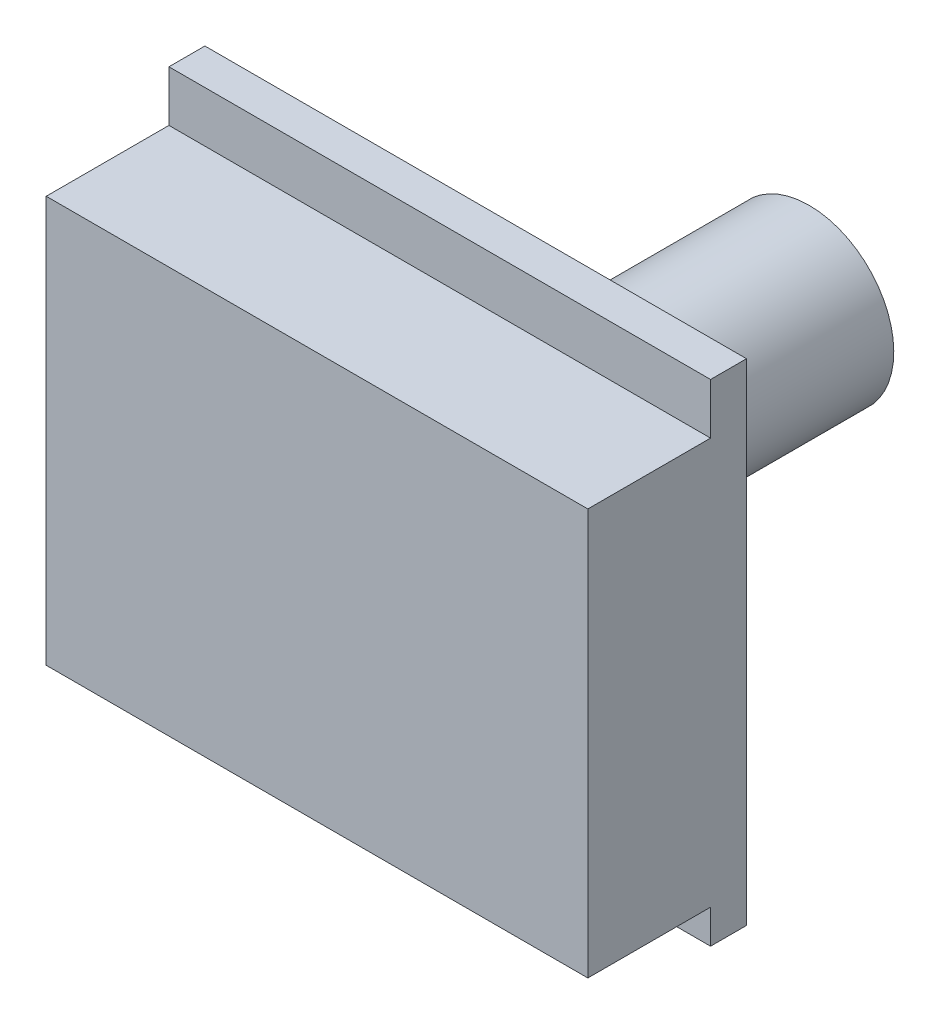
ISO-10303-21;
HEADER;
FILE_DESCRIPTION(('STEP AP214'),'2;1');
FILE_NAME('part.step','',(''),(''),'','','');
FILE_SCHEMA(('AUTOMOTIVE_DESIGN { 1 0 10303 214 1 1 1 1 }'));
ENDSEC;
DATA;
#1=APPLICATION_CONTEXT('core data for automotive mechanical design processes');
#2=APPLICATION_PROTOCOL_DEFINITION('international standard','automotive_design',2000,#1);
#3=PRODUCT_CONTEXT('',#1,'mechanical');
#4=PRODUCT('Part','Part','',(#3));
#5=PRODUCT_RELATED_PRODUCT_CATEGORY('part','',(#4));
#6=PRODUCT_DEFINITION_FORMATION('','',#4);
#7=PRODUCT_DEFINITION_CONTEXT('part definition',#1,'design');
#8=PRODUCT_DEFINITION('design','',#6,#7);
#9=PRODUCT_DEFINITION_SHAPE('','',#8);
#10=(LENGTH_UNIT() NAMED_UNIT(*) SI_UNIT(.MILLI.,.METRE.));
#11=(NAMED_UNIT(*) PLANE_ANGLE_UNIT() SI_UNIT($,.RADIAN.));
#12=(NAMED_UNIT(*) SI_UNIT($,.STERADIAN.) SOLID_ANGLE_UNIT());
#13=UNCERTAINTY_MEASURE_WITH_UNIT(LENGTH_MEASURE(1.E-05),#10,'distance_accuracy_value','');
#14=(GEOMETRIC_REPRESENTATION_CONTEXT(3) GLOBAL_UNCERTAINTY_ASSIGNED_CONTEXT((#13)) GLOBAL_UNIT_ASSIGNED_CONTEXT((#10,
#11,#12)) REPRESENTATION_CONTEXT('',''));
#15=CARTESIAN_POINT('',(0.,0.,0.));
#16=DIRECTION('',(0.,0.,1.));
#17=DIRECTION('',(1.,0.,0.));
#18=AXIS2_PLACEMENT_3D('',#15,#16,#17);
#19=CARTESIAN_POINT('',(5.65,-4.05,3.));
#20=DIRECTION('',(-1.,0.,0.));
#21=DIRECTION('',(0.,0.,1.));
#22=AXIS2_PLACEMENT_3D('',#19,#20,#21);
#23=PLANE('',#22);
#24=DIRECTION('',(0.,1.,0.));
#25=VECTOR('',#24,1.);
#26=CARTESIAN_POINT('',(5.65,-4.05,3.));
#27=LINE('',#26,#25);
#28=CARTESIAN_POINT('',(5.65,-4.05,3.));
#29=VERTEX_POINT('',#28);
#30=CARTESIAN_POINT('',(5.65,-0.500000000000001,3.));
#31=VERTEX_POINT('',#30);
#32=EDGE_CURVE('E393',#29,#31,#27,.T.);
#33=ORIENTED_EDGE('',*,*,#32,.T.);
#34=DIRECTION('',(0.,0.,1.));
#35=VECTOR('',#34,1.);
#36=CARTESIAN_POINT('',(5.65,-0.500000000000002,0.));
#37=LINE('',#36,#35);
#38=CARTESIAN_POINT('',(5.65,-0.500000000000001,0.));
#39=VERTEX_POINT('',#38);
#40=EDGE_CURVE('E61',#39,#31,#37,.T.);
#41=ORIENTED_EDGE('',*,*,#40,.F.);
#42=DIRECTION('',(0.,1.,0.));
#43=VECTOR('',#42,1.);
#44=CARTESIAN_POINT('',(5.65,-4.05,0.));
#45=LINE('',#44,#43);
#46=CARTESIAN_POINT('',(5.65,-4.05,0.));
#47=VERTEX_POINT('',#46);
#48=EDGE_CURVE('E409',#47,#39,#45,.T.);
#49=ORIENTED_EDGE('',*,*,#48,.F.);
#50=DIRECTION('',(0.,0.,-1.));
#51=VECTOR('',#50,1.);
#52=CARTESIAN_POINT('',(5.65,-4.05,3.));
#53=LINE('',#52,#51);
#54=EDGE_CURVE('E408',#29,#47,#53,.T.);
#55=ORIENTED_EDGE('',*,*,#54,.F.);
#56=EDGE_LOOP('',(#33,#41,#49,#55));
#57=FACE_BOUND('',#56,.T.);
#58=ADVANCED_FACE('F35',(#57),#23,.T.);
#59=CARTESIAN_POINT('',(-5.65,4.05,3.));
#60=DIRECTION('',(0.,-1.,0.));
#61=DIRECTION('',(0.,0.,-1.));
#62=AXIS2_PLACEMENT_3D('',#59,#60,#61);
#63=PLANE('',#62);
#64=DIRECTION('',(0.,0.,1.));
#65=VECTOR('',#64,1.);
#66=CARTESIAN_POINT('',(-0.5,4.05,0.));
#67=LINE('',#66,#65);
#68=CARTESIAN_POINT('',(-0.5,4.05,0.));
#69=VERTEX_POINT('',#68);
#70=CARTESIAN_POINT('',(-0.5,4.05,3.));
#71=VERTEX_POINT('',#70);
#72=EDGE_CURVE('E329',#69,#71,#67,.T.);
#73=ORIENTED_EDGE('',*,*,#72,.T.);
#74=DIRECTION('',(-1.,0.,0.));
#75=VECTOR('',#74,1.);
#76=CARTESIAN_POINT('',(-5.65,4.05,3.));
#77=LINE('',#76,#75);
#78=CARTESIAN_POINT('',(-5.65,4.05,3.));
#79=VERTEX_POINT('',#78);
#80=EDGE_CURVE('E395',#71,#79,#77,.T.);
#81=ORIENTED_EDGE('',*,*,#80,.T.);
#82=DIRECTION('',(0.,0.,-1.));
#83=VECTOR('',#82,1.);
#84=CARTESIAN_POINT('',(-5.65,4.05,3.));
#85=LINE('',#84,#83);
#86=CARTESIAN_POINT('',(-5.65,4.05,0.));
#87=VERTEX_POINT('',#86);
#88=EDGE_CURVE('E426',#79,#87,#85,.T.);
#89=ORIENTED_EDGE('',*,*,#88,.T.);
#90=DIRECTION('',(-1.,0.,0.));
#91=VECTOR('',#90,1.);
#92=CARTESIAN_POINT('',(-5.65,4.05,0.));
#93=LINE('',#92,#91);
#94=EDGE_CURVE('E411',#69,#87,#93,.T.);
#95=ORIENTED_EDGE('',*,*,#94,.F.);
#96=EDGE_LOOP('',(#73,#81,#89,#95));
#97=FACE_BOUND('',#96,.T.);
#98=ADVANCED_FACE('F481',(#97),#63,.T.);
#99=CARTESIAN_POINT('',(-5.65,-4.05,3.));
#100=DIRECTION('',(1.,0.,0.));
#101=DIRECTION('',(0.,0.,-1.));
#102=AXIS2_PLACEMENT_3D('',#99,#100,#101);
#103=PLANE('',#102);
#104=DIRECTION('',(0.,-1.,0.));
#105=VECTOR('',#104,1.);
#106=CARTESIAN_POINT('',(-5.65,-4.05,3.));
#107=LINE('',#106,#105);
#108=CARTESIAN_POINT('',(-5.65,0.5,3.));
#109=VERTEX_POINT('',#108);
#110=EDGE_CURVE('E401',#79,#109,#107,.T.);
#111=ORIENTED_EDGE('',*,*,#110,.T.);
#112=DIRECTION('',(0.,0.,1.));
#113=VECTOR('',#112,1.);
#114=CARTESIAN_POINT('',(-5.65,0.5,0.));
#115=LINE('',#114,#113);
#116=CARTESIAN_POINT('',(-5.65,0.5,0.));
#117=VERTEX_POINT('',#116);
#118=EDGE_CURVE('E235',#117,#109,#115,.T.);
#119=ORIENTED_EDGE('',*,*,#118,.F.);
#120=DIRECTION('',(0.,-1.,0.));
#121=VECTOR('',#120,1.);
#122=CARTESIAN_POINT('',(-5.65,-4.05,0.));
#123=LINE('',#122,#121);
#124=EDGE_CURVE('E245',#87,#117,#123,.T.);
#125=ORIENTED_EDGE('',*,*,#124,.F.);
#126=ORIENTED_EDGE('',*,*,#88,.F.);
#127=EDGE_LOOP('',(#111,#119,#125,#126));
#128=FACE_BOUND('',#127,.T.);
#129=ADVANCED_FACE('F485',(#128),#103,.T.);
#130=CARTESIAN_POINT('',(-5.65,-4.05,3.));
#131=DIRECTION('',(0.,1.,0.));
#132=DIRECTION('',(0.,0.,1.));
#133=AXIS2_PLACEMENT_3D('',#130,#131,#132);
#134=PLANE('',#133);
#135=DIRECTION('',(1.,0.,0.));
#136=VECTOR('',#135,1.);
#137=CARTESIAN_POINT('',(-5.65,-4.05,0.));
#138=LINE('',#137,#136);
#139=CARTESIAN_POINT('',(0.5,-4.05,0.));
#140=VERTEX_POINT('',#139);
#141=EDGE_CURVE('E417',#140,#47,#138,.T.);
#142=ORIENTED_EDGE('',*,*,#141,.F.);
#143=DIRECTION('',(0.,0.,1.));
#144=VECTOR('',#143,1.);
#145=CARTESIAN_POINT('',(0.499999999999999,-4.05,0.));
#146=LINE('',#145,#144);
#147=CARTESIAN_POINT('',(0.499999999999999,-4.05,3.));
#148=VERTEX_POINT('',#147);
#149=EDGE_CURVE('E308',#140,#148,#146,.T.);
#150=ORIENTED_EDGE('',*,*,#149,.T.);
#151=DIRECTION('',(1.,0.,0.));
#152=VECTOR('',#151,1.);
#153=CARTESIAN_POINT('',(-5.65,-4.05,3.));
#154=LINE('',#153,#152);
#155=EDGE_CURVE('E404',#148,#29,#154,.T.);
#156=ORIENTED_EDGE('',*,*,#155,.T.);
#157=ORIENTED_EDGE('',*,*,#54,.T.);
#158=EDGE_LOOP('',(#142,#150,#156,#157));
#159=FACE_BOUND('',#158,.T.);
#160=ADVANCED_FACE('F515',(#159),#134,.T.);
#161=CARTESIAN_POINT('',(0.,0.,3.));
#162=DIRECTION('',(0.,0.,1.));
#163=DIRECTION('',(1.,0.,0.));
#164=AXIS2_PLACEMENT_3D('',#161,#162,#163);
#165=PLANE('',#164);
#166=DIRECTION('',(1.,0.,0.));
#167=VECTOR('',#166,1.);
#168=CARTESIAN_POINT('',(0.,0.5,3.));
#169=LINE('',#168,#167);
#170=CARTESIAN_POINT('',(-1.93649167310371,0.5,3.));
#171=VERTEX_POINT('',#170);
#172=EDGE_CURVE('E231',#109,#171,#169,.T.);
#173=ORIENTED_EDGE('',*,*,#172,.F.);
#174=ORIENTED_EDGE('',*,*,#110,.F.);
#175=ORIENTED_EDGE('',*,*,#80,.F.);
#176=DIRECTION('',(0.,-1.,0.));
#177=VECTOR('',#176,1.);
#178=CARTESIAN_POINT('',(-0.500000000000001,0.,3.));
#179=LINE('',#178,#177);
#180=CARTESIAN_POINT('',(-0.5,1.93649167310371,3.));
#181=VERTEX_POINT('',#180);
#182=EDGE_CURVE('E290',#71,#181,#179,.T.);
#183=ORIENTED_EDGE('',*,*,#182,.T.);
#184=CARTESIAN_POINT('',(0.,0.,3.));
#185=DIRECTION('',(0.,0.,-1.));
#186=DIRECTION('',(-1.,0.,0.));
#187=AXIS2_PLACEMENT_3D('',#184,#185,#186);
#188=CIRCLE('',#187,2.);
#189=EDGE_CURVE('E288',#181,#171,#188,.F.);
#190=ORIENTED_EDGE('',*,*,#189,.T.);
#191=EDGE_LOOP('',(#173,#174,#175,#183,#190));
#192=FACE_BOUND('',#191,.T.);
#193=ADVANCED_FACE('F502',(#192),#165,.F.);
#194=CARTESIAN_POINT('',(0.,0.,3.));
#195=DIRECTION('',(0.,0.,-1.));
#196=DIRECTION('',(-1.,0.,0.));
#197=AXIS2_PLACEMENT_3D('',#194,#195,#196);
#198=CIRCLE('',#197,2.);
#199=CARTESIAN_POINT('',(-0.5,-1.93649167310371,3.));
#200=VERTEX_POINT('',#199);
#201=CARTESIAN_POINT('',(-1.93649167310371,-0.5,3.));
#202=VERTEX_POINT('',#201);
#203=EDGE_CURVE('E283',#200,#202,#198,.T.);
#204=ORIENTED_EDGE('',*,*,#203,.F.);
#205=DIRECTION('',(0.,-1.,0.));
#206=VECTOR('',#205,1.);
#207=CARTESIAN_POINT('',(-0.5,0.,3.));
#208=LINE('',#207,#206);
#209=CARTESIAN_POINT('',(-0.5,-4.05,3.));
#210=VERTEX_POINT('',#209);
#211=EDGE_CURVE('E281',#200,#210,#208,.T.);
#212=ORIENTED_EDGE('',*,*,#211,.T.);
#213=CARTESIAN_POINT('',(-5.65,-4.05,3.));
#214=VERTEX_POINT('',#213);
#215=EDGE_CURVE('E405',#214,#210,#154,.T.);
#216=ORIENTED_EDGE('',*,*,#215,.F.);
#217=CARTESIAN_POINT('',(-5.65,-0.5,3.));
#218=VERTEX_POINT('',#217);
#219=EDGE_CURVE('E400',#218,#214,#107,.T.);
#220=ORIENTED_EDGE('',*,*,#219,.F.);
#221=DIRECTION('',(1.,0.,0.));
#222=VECTOR('',#221,1.);
#223=CARTESIAN_POINT('',(0.,-0.5,3.));
#224=LINE('',#223,#222);
#225=EDGE_CURVE('E285',#218,#202,#224,.T.);
#226=ORIENTED_EDGE('',*,*,#225,.T.);
#227=EDGE_LOOP('',(#204,#212,#216,#220,#226));
#228=FACE_BOUND('',#227,.T.);
#229=ADVANCED_FACE('F495',(#228),#165,.F.);
#230=DIRECTION('',(-1.,0.,0.));
#231=VECTOR('',#230,1.);
#232=CARTESIAN_POINT('',(0.,-0.5,3.));
#233=LINE('',#232,#231);
#234=CARTESIAN_POINT('',(1.93649167310371,-0.500000000000001,3.));
#235=VERTEX_POINT('',#234);
#236=EDGE_CURVE('E298',#31,#235,#233,.T.);
#237=ORIENTED_EDGE('',*,*,#236,.F.);
#238=ORIENTED_EDGE('',*,*,#32,.F.);
#239=ORIENTED_EDGE('',*,*,#155,.F.);
#240=DIRECTION('',(0.,-1.,0.));
#241=VECTOR('',#240,1.);
#242=CARTESIAN_POINT('',(0.500000000000001,0.,3.));
#243=LINE('',#242,#241);
#244=CARTESIAN_POINT('',(0.5,-1.93649167310371,3.));
#245=VERTEX_POINT('',#244);
#246=EDGE_CURVE('E265',#245,#148,#243,.T.);
#247=ORIENTED_EDGE('',*,*,#246,.F.);
#248=CARTESIAN_POINT('',(0.,0.,3.));
#249=DIRECTION('',(0.,0.,-1.));
#250=DIRECTION('',(-1.,0.,0.));
#251=AXIS2_PLACEMENT_3D('',#248,#249,#250);
#252=CIRCLE('',#251,2.);
#253=EDGE_CURVE('E301',#235,#245,#252,.T.);
#254=ORIENTED_EDGE('',*,*,#253,.F.);
#255=EDGE_LOOP('',(#237,#238,#239,#247,#254));
#256=FACE_BOUND('',#255,.T.);
#257=ADVANCED_FACE('F490',(#256),#165,.F.);
#258=CARTESIAN_POINT('',(0.,0.,0.));
#259=DIRECTION('',(0.,0.,-1.));
#260=DIRECTION('',(-1.,0.,0.));
#261=AXIS2_PLACEMENT_3D('',#258,#259,#260);
#262=PLANE('',#261);
#263=CARTESIAN_POINT('',(0.,0.,0.));
#264=DIRECTION('',(0.,0.,-1.));
#265=DIRECTION('',(-1.,0.,0.));
#266=AXIS2_PLACEMENT_3D('',#263,#264,#265);
#267=CIRCLE('',#266,2.);
#268=CARTESIAN_POINT('',(-0.5,1.93649167310371,0.));
#269=VERTEX_POINT('',#268);
#270=CARTESIAN_POINT('',(0.5,1.93649167310371,0.));
#271=VERTEX_POINT('',#270);
#272=EDGE_CURVE('E11',#269,#271,#267,.T.);
#273=ORIENTED_EDGE('',*,*,#272,.F.);
#274=DIRECTION('',(0.,-1.,0.));
#275=VECTOR('',#274,1.);
#276=CARTESIAN_POINT('',(-0.500000000000001,0.,0.));
#277=LINE('',#276,#275);
#278=EDGE_CURVE('E246',#69,#269,#277,.T.);
#279=ORIENTED_EDGE('',*,*,#278,.F.);
#280=ORIENTED_EDGE('',*,*,#94,.T.);
#281=ORIENTED_EDGE('',*,*,#124,.T.);
#282=DIRECTION('',(1.,0.,0.));
#283=VECTOR('',#282,1.);
#284=CARTESIAN_POINT('',(0.,0.5,0.));
#285=LINE('',#284,#283);
#286=CARTESIAN_POINT('',(-1.93649167310371,0.5,0.));
#287=VERTEX_POINT('',#286);
#288=EDGE_CURVE('E230',#117,#287,#285,.T.);
#289=ORIENTED_EDGE('',*,*,#288,.T.);
#290=CARTESIAN_POINT('',(-1.93649167310371,-0.5,0.));
#291=VERTEX_POINT('',#290);
#292=EDGE_CURVE('E46',#291,#287,#267,.T.);
#293=ORIENTED_EDGE('',*,*,#292,.F.);
#294=DIRECTION('',(1.,0.,0.));
#295=VECTOR('',#294,1.);
#296=CARTESIAN_POINT('',(0.,-0.5,0.));
#297=LINE('',#296,#295);
#298=CARTESIAN_POINT('',(-5.65,-0.5,0.));
#299=VERTEX_POINT('',#298);
#300=EDGE_CURVE('E247',#299,#291,#297,.T.);
#301=ORIENTED_EDGE('',*,*,#300,.F.);
#302=CARTESIAN_POINT('',(-5.65,-4.05,0.));
#303=VERTEX_POINT('',#302);
#304=EDGE_CURVE('E415',#299,#303,#123,.T.);
#305=ORIENTED_EDGE('',*,*,#304,.T.);
#306=CARTESIAN_POINT('',(-0.5,-4.05,0.));
#307=VERTEX_POINT('',#306);
#308=EDGE_CURVE('E418',#303,#307,#138,.T.);
#309=ORIENTED_EDGE('',*,*,#308,.T.);
#310=DIRECTION('',(0.,-1.,0.));
#311=VECTOR('',#310,1.);
#312=CARTESIAN_POINT('',(-0.5,0.,0.));
#313=LINE('',#312,#311);
#314=CARTESIAN_POINT('',(-0.5,-1.93649167310371,0.));
#315=VERTEX_POINT('',#314);
#316=EDGE_CURVE('E262',#315,#307,#313,.T.);
#317=ORIENTED_EDGE('',*,*,#316,.F.);
#318=CARTESIAN_POINT('',(0.5,-1.93649167310371,0.));
#319=VERTEX_POINT('',#318);
#320=EDGE_CURVE('E255',#319,#315,#267,.T.);
#321=ORIENTED_EDGE('',*,*,#320,.F.);
#322=DIRECTION('',(0.,-1.,0.));
#323=VECTOR('',#322,1.);
#324=CARTESIAN_POINT('',(0.500000000000001,0.,0.));
#325=LINE('',#324,#323);
#326=EDGE_CURVE('E277',#319,#140,#325,.T.);
#327=ORIENTED_EDGE('',*,*,#326,.T.);
#328=ORIENTED_EDGE('',*,*,#141,.T.);
#329=ORIENTED_EDGE('',*,*,#48,.T.);
#330=DIRECTION('',(-1.,0.,0.));
#331=VECTOR('',#330,1.);
#332=CARTESIAN_POINT('',(0.,-0.5,0.));
#333=LINE('',#332,#331);
#334=CARTESIAN_POINT('',(1.93649167310371,-0.500000000000001,0.));
#335=VERTEX_POINT('',#334);
#336=EDGE_CURVE('E275',#39,#335,#333,.T.);
#337=ORIENTED_EDGE('',*,*,#336,.T.);
#338=CARTESIAN_POINT('',(1.93649167310371,0.499999999999998,0.));
#339=VERTEX_POINT('',#338);
#340=EDGE_CURVE('E44',#339,#335,#267,.T.);
#341=ORIENTED_EDGE('',*,*,#340,.F.);
#342=DIRECTION('',(-1.,0.,0.));
#343=VECTOR('',#342,1.);
#344=CARTESIAN_POINT('',(0.,0.499999999999999,0.));
#345=LINE('',#344,#343);
#346=CARTESIAN_POINT('',(5.65,0.499999999999998,0.));
#347=VERTEX_POINT('',#346);
#348=EDGE_CURVE('E272',#347,#339,#345,.T.);
#349=ORIENTED_EDGE('',*,*,#348,.F.);
#350=CARTESIAN_POINT('',(5.65,4.05,0.));
#351=VERTEX_POINT('',#350);
#352=EDGE_CURVE('E53',#347,#351,#45,.T.);
#353=ORIENTED_EDGE('',*,*,#352,.T.);
#354=CARTESIAN_POINT('',(0.5,4.05,0.));
#355=VERTEX_POINT('',#354);
#356=EDGE_CURVE('E412',#351,#355,#93,.T.);
#357=ORIENTED_EDGE('',*,*,#356,.T.);
#358=DIRECTION('',(0.,1.,0.));
#359=VECTOR('',#358,1.);
#360=CARTESIAN_POINT('',(0.500000000000001,0.,0.));
#361=LINE('',#360,#359);
#362=EDGE_CURVE('E269',#271,#355,#361,.T.);
#363=ORIENTED_EDGE('',*,*,#362,.F.);
#364=EDGE_LOOP('',(#273,#279,#280,#281,#289,#293,#301,#305,#309,#317,#321,#327,#328,#329,#337,
#341,#349,#353,#357,#363));
#365=FACE_BOUND('',#364,.T.);
#366=DIRECTION('',(0.,-1.,0.));
#367=VECTOR('',#366,1.);
#368=CARTESIAN_POINT('',(-6.4,4.8,0.));
#369=LINE('',#368,#367);
#370=CARTESIAN_POINT('',(-6.4,6.,0.));
#371=VERTEX_POINT('',#370);
#372=CARTESIAN_POINT('',(-6.4,-5.6,0.));
#373=VERTEX_POINT('',#372);
#374=EDGE_CURVE('E431',#371,#373,#369,.T.);
#375=ORIENTED_EDGE('',*,*,#374,.F.);
#376=DIRECTION('',(1.,0.,0.));
#377=VECTOR('',#376,1.);
#378=CARTESIAN_POINT('',(-6.4,6.,0.));
#379=LINE('',#378,#377);
#380=CARTESIAN_POINT('',(6.4,6.,0.));
#381=VERTEX_POINT('',#380);
#382=EDGE_CURVE('E359',#371,#381,#379,.T.);
#383=ORIENTED_EDGE('',*,*,#382,.T.);
#384=DIRECTION('',(0.,1.,0.));
#385=VECTOR('',#384,1.);
#386=CARTESIAN_POINT('',(6.4,4.8,0.));
#387=LINE('',#386,#385);
#388=CARTESIAN_POINT('',(6.4,-5.6,0.));
#389=VERTEX_POINT('',#388);
#390=EDGE_CURVE('E433',#389,#381,#387,.T.);
#391=ORIENTED_EDGE('',*,*,#390,.F.);
#392=DIRECTION('',(-1.,0.,0.));
#393=VECTOR('',#392,1.);
#394=CARTESIAN_POINT('',(-6.4,-5.6,0.));
#395=LINE('',#394,#393);
#396=EDGE_CURVE('E340',#389,#373,#395,.T.);
#397=ORIENTED_EDGE('',*,*,#396,.T.);
#398=EDGE_LOOP('',(#375,#383,#391,#397));
#399=FACE_BOUND('',#398,.T.);
#400=ADVANCED_FACE('F240',(#365,#399),#262,.T.);
#401=CARTESIAN_POINT('',(-6.4,4.8,3.));
#402=DIRECTION('',(1.,0.,0.));
#403=DIRECTION('',(0.,0.,-1.));
#404=AXIS2_PLACEMENT_3D('',#401,#402,#403);
#405=PLANE('',#404);
#406=ORIENTED_EDGE('',*,*,#374,.T.);
#407=DIRECTION('',(0.,0.,-1.));
#408=VECTOR('',#407,1.);
#409=CARTESIAN_POINT('',(-6.4,-5.6,0.85));
#410=LINE('',#409,#408);
#411=CARTESIAN_POINT('',(-6.4,-5.6,0.85));
#412=VERTEX_POINT('',#411);
#413=EDGE_CURVE('E356',#412,#373,#410,.T.);
#414=ORIENTED_EDGE('',*,*,#413,.F.);
#415=DIRECTION('',(0.,1.,0.));
#416=VECTOR('',#415,1.);
#417=CARTESIAN_POINT('',(-6.4,-4.8,0.85));
#418=LINE('',#417,#416);
#419=CARTESIAN_POINT('',(-6.4,-4.8,0.85));
#420=VERTEX_POINT('',#419);
#421=EDGE_CURVE('E341',#412,#420,#418,.T.);
#422=ORIENTED_EDGE('',*,*,#421,.T.);
#423=DIRECTION('',(0.,0.,-1.));
#424=VECTOR('',#423,1.);
#425=CARTESIAN_POINT('',(-6.4,-4.8,3.));
#426=LINE('',#425,#424);
#427=CARTESIAN_POINT('',(-6.4,-4.8,3.75));
#428=VERTEX_POINT('',#427);
#429=EDGE_CURVE('E39',#428,#420,#426,.T.);
#430=ORIENTED_EDGE('',*,*,#429,.F.);
#431=DIRECTION('',(0.,-1.,0.));
#432=VECTOR('',#431,1.);
#433=CARTESIAN_POINT('',(-6.4,4.8,3.75));
#434=LINE('',#433,#432);
#435=CARTESIAN_POINT('',(-6.4,4.8,3.75));
#436=VERTEX_POINT('',#435);
#437=EDGE_CURVE('E379',#436,#428,#434,.T.);
#438=ORIENTED_EDGE('',*,*,#437,.F.);
#439=DIRECTION('',(0.,0.,-1.));
#440=VECTOR('',#439,1.);
#441=CARTESIAN_POINT('',(-6.4,4.8,3.));
#442=LINE('',#441,#440);
#443=CARTESIAN_POINT('',(-6.4,4.8,0.85));
#444=VERTEX_POINT('',#443);
#445=EDGE_CURVE('E435',#436,#444,#442,.T.);
#446=ORIENTED_EDGE('',*,*,#445,.T.);
#447=DIRECTION('',(0.,1.,0.));
#448=VECTOR('',#447,1.);
#449=CARTESIAN_POINT('',(-6.4,4.8,0.85));
#450=LINE('',#449,#448);
#451=CARTESIAN_POINT('',(-6.4,6.,0.85));
#452=VERTEX_POINT('',#451);
#453=EDGE_CURVE('E362',#444,#452,#450,.T.);
#454=ORIENTED_EDGE('',*,*,#453,.T.);
#455=DIRECTION('',(0.,0.,-1.));
#456=VECTOR('',#455,1.);
#457=CARTESIAN_POINT('',(-6.4,6.,0.85));
#458=LINE('',#457,#456);
#459=EDGE_CURVE('E373',#452,#371,#458,.T.);
#460=ORIENTED_EDGE('',*,*,#459,.T.);
#461=EDGE_LOOP('',(#406,#414,#422,#430,#438,#446,#454,#460));
#462=FACE_BOUND('',#461,.T.);
#463=ADVANCED_FACE('F37',(#462),#405,.F.);
#464=CARTESIAN_POINT('',(6.4,-4.8,3.));
#465=DIRECTION('',(0.,1.,0.));
#466=DIRECTION('',(0.,0.,1.));
#467=AXIS2_PLACEMENT_3D('',#464,#465,#466);
#468=PLANE('',#467);
#469=ORIENTED_EDGE('',*,*,#429,.T.);
#470=DIRECTION('',(1.,0.,0.));
#471=VECTOR('',#470,1.);
#472=CARTESIAN_POINT('',(-6.4,-4.8,0.85));
#473=LINE('',#472,#471);
#474=CARTESIAN_POINT('',(6.4,-4.8,0.85));
#475=VERTEX_POINT('',#474);
#476=EDGE_CURVE('E344',#420,#475,#473,.T.);
#477=ORIENTED_EDGE('',*,*,#476,.T.);
#478=DIRECTION('',(0.,0.,-1.));
#479=VECTOR('',#478,1.);
#480=CARTESIAN_POINT('',(6.4,-4.8,3.));
#481=LINE('',#480,#479);
#482=CARTESIAN_POINT('',(6.4,-4.8,3.75));
#483=VERTEX_POINT('',#482);
#484=EDGE_CURVE('E258',#483,#475,#481,.T.);
#485=ORIENTED_EDGE('',*,*,#484,.F.);
#486=DIRECTION('',(1.,0.,0.));
#487=VECTOR('',#486,1.);
#488=CARTESIAN_POINT('',(-6.4,-4.8,3.75));
#489=LINE('',#488,#487);
#490=EDGE_CURVE('E384',#428,#483,#489,.T.);
#491=ORIENTED_EDGE('',*,*,#490,.F.);
#492=EDGE_LOOP('',(#469,#477,#485,#491));
#493=FACE_BOUND('',#492,.T.);
#494=ADVANCED_FACE('F447',(#493),#468,.F.);
#495=CARTESIAN_POINT('',(6.4,4.8,3.));
#496=DIRECTION('',(-1.,0.,0.));
#497=DIRECTION('',(0.,0.,1.));
#498=AXIS2_PLACEMENT_3D('',#495,#496,#497);
#499=PLANE('',#498);
#500=ORIENTED_EDGE('',*,*,#390,.T.);
#501=DIRECTION('',(0.,0.,-1.));
#502=VECTOR('',#501,1.);
#503=CARTESIAN_POINT('',(6.4,6.,0.85));
#504=LINE('',#503,#502);
#505=CARTESIAN_POINT('',(6.4,6.,0.85));
#506=VERTEX_POINT('',#505);
#507=EDGE_CURVE('E376',#506,#381,#504,.T.);
#508=ORIENTED_EDGE('',*,*,#507,.F.);
#509=DIRECTION('',(0.,-1.,0.));
#510=VECTOR('',#509,1.);
#511=CARTESIAN_POINT('',(6.4,4.8,0.85));
#512=LINE('',#511,#510);
#513=CARTESIAN_POINT('',(6.4,4.8,0.85));
#514=VERTEX_POINT('',#513);
#515=EDGE_CURVE('E368',#506,#514,#512,.T.);
#516=ORIENTED_EDGE('',*,*,#515,.T.);
#517=DIRECTION('',(0.,0.,-1.));
#518=VECTOR('',#517,1.);
#519=CARTESIAN_POINT('',(6.4,4.8,3.));
#520=LINE('',#519,#518);
#521=CARTESIAN_POINT('',(6.4,4.8,3.75));
#522=VERTEX_POINT('',#521);
#523=EDGE_CURVE('E438',#522,#514,#520,.T.);
#524=ORIENTED_EDGE('',*,*,#523,.F.);
#525=DIRECTION('',(0.,1.,0.));
#526=VECTOR('',#525,1.);
#527=CARTESIAN_POINT('',(6.4,4.8,3.75));
#528=LINE('',#527,#526);
#529=EDGE_CURVE('E387',#483,#522,#528,.T.);
#530=ORIENTED_EDGE('',*,*,#529,.F.);
#531=ORIENTED_EDGE('',*,*,#484,.T.);
#532=DIRECTION('',(0.,-1.,0.));
#533=VECTOR('',#532,1.);
#534=CARTESIAN_POINT('',(6.4,-4.8,0.85));
#535=LINE('',#534,#533);
#536=CARTESIAN_POINT('',(6.4,-5.6,0.85));
#537=VERTEX_POINT('',#536);
#538=EDGE_CURVE('E347',#475,#537,#535,.T.);
#539=ORIENTED_EDGE('',*,*,#538,.T.);
#540=DIRECTION('',(0.,0.,-1.));
#541=VECTOR('',#540,1.);
#542=CARTESIAN_POINT('',(6.4,-5.6,0.85));
#543=LINE('',#542,#541);
#544=EDGE_CURVE('E353',#537,#389,#543,.T.);
#545=ORIENTED_EDGE('',*,*,#544,.T.);
#546=EDGE_LOOP('',(#500,#508,#516,#524,#530,#531,#539,#545));
#547=FACE_BOUND('',#546,.T.);
#548=ADVANCED_FACE('F443',(#547),#499,.F.);
#549=CARTESIAN_POINT('',(6.4,4.8,3.));
#550=DIRECTION('',(0.,-1.,0.));
#551=DIRECTION('',(0.,0.,-1.));
#552=AXIS2_PLACEMENT_3D('',#549,#550,#551);
#553=PLANE('',#552);
#554=ORIENTED_EDGE('',*,*,#523,.T.);
#555=DIRECTION('',(-1.,0.,0.));
#556=VECTOR('',#555,1.);
#557=CARTESIAN_POINT('',(-6.4,4.8,0.85));
#558=LINE('',#557,#556);
#559=EDGE_CURVE('E370',#514,#444,#558,.T.);
#560=ORIENTED_EDGE('',*,*,#559,.T.);
#561=ORIENTED_EDGE('',*,*,#445,.F.);
#562=DIRECTION('',(-1.,0.,0.));
#563=VECTOR('',#562,1.);
#564=CARTESIAN_POINT('',(-6.4,4.8,3.75));
#565=LINE('',#564,#563);
#566=EDGE_CURVE('E390',#522,#436,#565,.T.);
#567=ORIENTED_EDGE('',*,*,#566,.F.);
#568=EDGE_LOOP('',(#554,#560,#561,#567));
#569=FACE_BOUND('',#568,.T.);
#570=ADVANCED_FACE('F468',(#569),#553,.F.);
#571=DIRECTION('',(0.,0.,1.));
#572=VECTOR('',#571,1.);
#573=CARTESIAN_POINT('',(5.65,0.499999999999998,0.));
#574=LINE('',#573,#572);
#575=CARTESIAN_POINT('',(5.65,0.499999999999998,3.));
#576=VERTEX_POINT('',#575);
#577=EDGE_CURVE('E318',#347,#576,#574,.T.);
#578=ORIENTED_EDGE('',*,*,#577,.T.);
#579=CARTESIAN_POINT('',(5.65,4.05,3.));
#580=VERTEX_POINT('',#579);
#581=EDGE_CURVE('E396',#576,#580,#27,.T.);
#582=ORIENTED_EDGE('',*,*,#581,.T.);
#583=DIRECTION('',(0.,0.,-1.));
#584=VECTOR('',#583,1.);
#585=CARTESIAN_POINT('',(5.65,4.05,3.));
#586=LINE('',#585,#584);
#587=EDGE_CURVE('E429',#580,#351,#586,.T.);
#588=ORIENTED_EDGE('',*,*,#587,.T.);
#589=ORIENTED_EDGE('',*,*,#352,.F.);
#590=EDGE_LOOP('',(#578,#582,#588,#589));
#591=FACE_BOUND('',#590,.T.);
#592=ADVANCED_FACE('F470',(#591),#23,.T.);
#593=DIRECTION('',(0.,0.,1.));
#594=VECTOR('',#593,1.);
#595=CARTESIAN_POINT('',(0.499999999999999,4.05,0.));
#596=LINE('',#595,#594);
#597=CARTESIAN_POINT('',(0.5,4.05,3.));
#598=VERTEX_POINT('',#597);
#599=EDGE_CURVE('E326',#355,#598,#596,.T.);
#600=ORIENTED_EDGE('',*,*,#599,.F.);
#601=ORIENTED_EDGE('',*,*,#356,.F.);
#602=ORIENTED_EDGE('',*,*,#587,.F.);
#603=EDGE_CURVE('E397',#580,#598,#77,.T.);
#604=ORIENTED_EDGE('',*,*,#603,.T.);
#605=EDGE_LOOP('',(#600,#601,#602,#604));
#606=FACE_BOUND('',#605,.T.);
#607=ADVANCED_FACE('F476',(#606),#63,.T.);
#608=DIRECTION('',(0.,0.,1.));
#609=VECTOR('',#608,1.);
#610=CARTESIAN_POINT('',(-5.65,-0.5,0.));
#611=LINE('',#610,#609);
#612=EDGE_CURVE('E334',#299,#218,#611,.T.);
#613=ORIENTED_EDGE('',*,*,#612,.T.);
#614=ORIENTED_EDGE('',*,*,#219,.T.);
#615=DIRECTION('',(0.,0.,-1.));
#616=VECTOR('',#615,1.);
#617=CARTESIAN_POINT('',(-5.65,-4.05,3.));
#618=LINE('',#617,#616);
#619=EDGE_CURVE('E423',#214,#303,#618,.T.);
#620=ORIENTED_EDGE('',*,*,#619,.T.);
#621=ORIENTED_EDGE('',*,*,#304,.F.);
#622=EDGE_LOOP('',(#613,#614,#620,#621));
#623=FACE_BOUND('',#622,.T.);
#624=ADVANCED_FACE('F513',(#623),#103,.T.);
#625=DIRECTION('',(0.,0.,1.));
#626=VECTOR('',#625,1.);
#627=CARTESIAN_POINT('',(-0.5,-4.05,0.));
#628=LINE('',#627,#626);
#629=EDGE_CURVE('E280',#307,#210,#628,.T.);
#630=ORIENTED_EDGE('',*,*,#629,.F.);
#631=ORIENTED_EDGE('',*,*,#308,.F.);
#632=ORIENTED_EDGE('',*,*,#619,.F.);
#633=ORIENTED_EDGE('',*,*,#215,.T.);
#634=EDGE_LOOP('',(#630,#631,#632,#633));
#635=FACE_BOUND('',#634,.T.);
#636=ADVANCED_FACE('F507',(#635),#134,.T.);
#637=CARTESIAN_POINT('',(0.,0.,3.));
#638=DIRECTION('',(0.,0.,-1.));
#639=DIRECTION('',(-1.,0.,0.));
#640=AXIS2_PLACEMENT_3D('',#637,#638,#639);
#641=CIRCLE('',#640,2.);
#642=CARTESIAN_POINT('',(1.93649167310371,0.499999999999998,3.));
#643=VERTEX_POINT('',#642);
#644=CARTESIAN_POINT('',(0.5,1.93649167310371,3.));
#645=VERTEX_POINT('',#644);
#646=EDGE_CURVE('E294',#643,#645,#641,.F.);
#647=ORIENTED_EDGE('',*,*,#646,.T.);
#648=DIRECTION('',(0.,1.,0.));
#649=VECTOR('',#648,1.);
#650=CARTESIAN_POINT('',(0.500000000000001,0.,3.));
#651=LINE('',#650,#649);
#652=EDGE_CURVE('E292',#645,#598,#651,.T.);
#653=ORIENTED_EDGE('',*,*,#652,.T.);
#654=ORIENTED_EDGE('',*,*,#603,.F.);
#655=ORIENTED_EDGE('',*,*,#581,.F.);
#656=DIRECTION('',(-1.,0.,0.));
#657=VECTOR('',#656,1.);
#658=CARTESIAN_POINT('',(0.,0.499999999999999,3.));
#659=LINE('',#658,#657);
#660=EDGE_CURVE('E296',#576,#643,#659,.T.);
#661=ORIENTED_EDGE('',*,*,#660,.T.);
#662=EDGE_LOOP('',(#647,#653,#654,#655,#661));
#663=FACE_BOUND('',#662,.T.);
#664=ADVANCED_FACE('F498',(#663),#165,.F.);
#665=CARTESIAN_POINT('',(0.,0.,3.75));
#666=DIRECTION('',(0.,0.,1.));
#667=DIRECTION('',(1.,0.,0.));
#668=AXIS2_PLACEMENT_3D('',#665,#666,#667);
#669=PLANE('',#668);
#670=ORIENTED_EDGE('',*,*,#437,.T.);
#671=ORIENTED_EDGE('',*,*,#490,.T.);
#672=ORIENTED_EDGE('',*,*,#529,.T.);
#673=ORIENTED_EDGE('',*,*,#566,.T.);
#674=EDGE_LOOP('',(#670,#671,#672,#673));
#675=FACE_BOUND('',#674,.T.);
#676=ADVANCED_FACE('F449',(#675),#669,.T.);
#677=CARTESIAN_POINT('',(-6.4,6.,0.85));
#678=DIRECTION('',(0.,1.,0.));
#679=DIRECTION('',(-1.,0.,0.));
#680=AXIS2_PLACEMENT_3D('',#677,#678,#679);
#681=PLANE('',#680);
#682=ORIENTED_EDGE('',*,*,#382,.F.);
#683=ORIENTED_EDGE('',*,*,#459,.F.);
#684=DIRECTION('',(1.,0.,0.));
#685=VECTOR('',#684,1.);
#686=CARTESIAN_POINT('',(-6.4,6.,0.85));
#687=LINE('',#686,#685);
#688=EDGE_CURVE('E365',#452,#506,#687,.T.);
#689=ORIENTED_EDGE('',*,*,#688,.T.);
#690=ORIENTED_EDGE('',*,*,#507,.T.);
#691=EDGE_LOOP('',(#682,#683,#689,#690));
#692=FACE_BOUND('',#691,.T.);
#693=ADVANCED_FACE('F462',(#692),#681,.T.);
#694=CARTESIAN_POINT('',(0.,0.,0.85));
#695=DIRECTION('',(0.,0.,-1.));
#696=DIRECTION('',(-1.,0.,0.));
#697=AXIS2_PLACEMENT_3D('',#694,#695,#696);
#698=PLANE('',#697);
#699=ORIENTED_EDGE('',*,*,#453,.F.);
#700=ORIENTED_EDGE('',*,*,#559,.F.);
#701=ORIENTED_EDGE('',*,*,#515,.F.);
#702=ORIENTED_EDGE('',*,*,#688,.F.);
#703=EDGE_LOOP('',(#699,#700,#701,#702));
#704=FACE_BOUND('',#703,.T.);
#705=ADVANCED_FACE('F465',(#704),#698,.F.);
#706=CARTESIAN_POINT('',(-6.4,-5.6,0.85));
#707=DIRECTION('',(0.,-1.,0.));
#708=DIRECTION('',(1.,0.,0.));
#709=AXIS2_PLACEMENT_3D('',#706,#707,#708);
#710=PLANE('',#709);
#711=ORIENTED_EDGE('',*,*,#396,.F.);
#712=ORIENTED_EDGE('',*,*,#544,.F.);
#713=DIRECTION('',(-1.,0.,0.));
#714=VECTOR('',#713,1.);
#715=CARTESIAN_POINT('',(-6.4,-5.6,0.85));
#716=LINE('',#715,#714);
#717=EDGE_CURVE('E350',#537,#412,#716,.T.);
#718=ORIENTED_EDGE('',*,*,#717,.T.);
#719=ORIENTED_EDGE('',*,*,#413,.T.);
#720=EDGE_LOOP('',(#711,#712,#718,#719));
#721=FACE_BOUND('',#720,.T.);
#722=ADVANCED_FACE('F458',(#721),#710,.T.);
#723=CARTESIAN_POINT('',(0.,0.,0.85));
#724=DIRECTION('',(0.,0.,1.));
#725=DIRECTION('',(1.,0.,0.));
#726=AXIS2_PLACEMENT_3D('',#723,#724,#725);
#727=PLANE('',#726);
#728=ORIENTED_EDGE('',*,*,#421,.F.);
#729=ORIENTED_EDGE('',*,*,#717,.F.);
#730=ORIENTED_EDGE('',*,*,#538,.F.);
#731=ORIENTED_EDGE('',*,*,#476,.F.);
#732=EDGE_LOOP('',(#728,#729,#730,#731));
#733=FACE_BOUND('',#732,.T.);
#734=ADVANCED_FACE('F455',(#733),#727,.T.);
#735=CARTESIAN_POINT('',(-0.5,0.,0.));
#736=DIRECTION('',(-1.,0.,0.));
#737=DIRECTION('',(0.,-1.,0.));
#738=AXIS2_PLACEMENT_3D('',#735,#736,#737);
#739=PLANE('',#738);
#740=ORIENTED_EDGE('',*,*,#211,.F.);
#741=DIRECTION('',(0.,0.,1.));
#742=VECTOR('',#741,1.);
#743=CARTESIAN_POINT('',(-0.5,-1.93649167310371,0.));
#744=LINE('',#743,#742);
#745=EDGE_CURVE('E337',#315,#200,#744,.T.);
#746=ORIENTED_EDGE('',*,*,#745,.F.);
#747=ORIENTED_EDGE('',*,*,#316,.T.);
#748=ORIENTED_EDGE('',*,*,#629,.T.);
#749=EDGE_LOOP('',(#740,#746,#747,#748));
#750=FACE_BOUND('',#749,.T.);
#751=ADVANCED_FACE('F562',(#750),#739,.T.);
#752=CARTESIAN_POINT('',(0.,0.,0.));
#753=DIRECTION('',(0.,0.,1.));
#754=DIRECTION('',(1.,0.,0.));
#755=AXIS2_PLACEMENT_3D('',#752,#753,#754);
#756=CYLINDRICAL_SURFACE('',#755,2.);
#757=ORIENTED_EDGE('',*,*,#203,.T.);
#758=DIRECTION('',(0.,0.,1.));
#759=VECTOR('',#758,1.);
#760=CARTESIAN_POINT('',(-1.93649167310371,-0.5,0.));
#761=LINE('',#760,#759);
#762=EDGE_CURVE('E253',#291,#202,#761,.T.);
#763=ORIENTED_EDGE('',*,*,#762,.F.);
#764=ORIENTED_EDGE('',*,*,#292,.T.);
#765=DIRECTION('',(0.,0.,1.));
#766=VECTOR('',#765,1.);
#767=CARTESIAN_POINT('',(-1.93649167310371,0.5,0.));
#768=LINE('',#767,#766);
#769=EDGE_CURVE('E226',#287,#171,#768,.T.);
#770=ORIENTED_EDGE('',*,*,#769,.T.);
#771=ORIENTED_EDGE('',*,*,#189,.F.);
#772=DIRECTION('',(0.,0.,1.));
#773=VECTOR('',#772,1.);
#774=CARTESIAN_POINT('',(-0.5,1.93649167310371,0.));
#775=LINE('',#774,#773);
#776=EDGE_CURVE('E236',#269,#181,#775,.T.);
#777=ORIENTED_EDGE('',*,*,#776,.F.);
#778=ORIENTED_EDGE('',*,*,#272,.T.);
#779=DIRECTION('',(0.,0.,1.));
#780=VECTOR('',#779,1.);
#781=CARTESIAN_POINT('',(0.5,1.93649167310371,0.));
#782=LINE('',#781,#780);
#783=EDGE_CURVE('E323',#271,#645,#782,.T.);
#784=ORIENTED_EDGE('',*,*,#783,.T.);
#785=ORIENTED_EDGE('',*,*,#646,.F.);
#786=DIRECTION('',(0.,0.,1.));
#787=VECTOR('',#786,1.);
#788=CARTESIAN_POINT('',(1.93649167310371,0.499999999999998,0.));
#789=LINE('',#788,#787);
#790=EDGE_CURVE('E320',#339,#643,#789,.T.);
#791=ORIENTED_EDGE('',*,*,#790,.F.);
#792=ORIENTED_EDGE('',*,*,#340,.T.);
#793=DIRECTION('',(0.,0.,1.));
#794=VECTOR('',#793,1.);
#795=CARTESIAN_POINT('',(1.93649167310371,-0.500000000000001,0.));
#796=LINE('',#795,#794);
#797=EDGE_CURVE('E314',#335,#235,#796,.T.);
#798=ORIENTED_EDGE('',*,*,#797,.T.);
#799=ORIENTED_EDGE('',*,*,#253,.T.);
#800=DIRECTION('',(0.,0.,1.));
#801=VECTOR('',#800,1.);
#802=CARTESIAN_POINT('',(0.5,-1.93649167310371,0.));
#803=LINE('',#802,#801);
#804=EDGE_CURVE('E311',#319,#245,#803,.T.);
#805=ORIENTED_EDGE('',*,*,#804,.F.);
#806=ORIENTED_EDGE('',*,*,#320,.T.);
#807=ORIENTED_EDGE('',*,*,#745,.T.);
#808=EDGE_LOOP('',(#757,#763,#764,#770,#771,#777,#778,#784,#785,#791,#792,#798,#799,#805,#806,#807));
#809=FACE_BOUND('',#808,.T.);
#810=CARTESIAN_POINT('',(0.,0.,-7.88));
#811=DIRECTION('',(0.,0.,-1.));
#812=DIRECTION('',(-1.,0.,0.));
#813=AXIS2_PLACEMENT_3D('',#810,#811,#812);
#814=CIRCLE('',#813,2.);
#815=CARTESIAN_POINT('',(-2.,0.,-7.88));
#816=VERTEX_POINT('',#815);
#817=EDGE_CURVE('E261',#816,#816,#814,.T.);
#818=ORIENTED_EDGE('',*,*,#817,.F.);
#819=EDGE_LOOP('',(#818));
#820=FACE_BOUND('',#819,.T.);
#821=ADVANCED_FACE('F250',(#809,#820),#756,.T.);
#822=CARTESIAN_POINT('',(0.,-0.5,0.));
#823=DIRECTION('',(0.,-1.,0.));
#824=DIRECTION('',(1.,0.,0.));
#825=AXIS2_PLACEMENT_3D('',#822,#823,#824);
#826=PLANE('',#825);
#827=ORIENTED_EDGE('',*,*,#225,.F.);
#828=ORIENTED_EDGE('',*,*,#612,.F.);
#829=ORIENTED_EDGE('',*,*,#300,.T.);
#830=ORIENTED_EDGE('',*,*,#762,.T.);
#831=EDGE_LOOP('',(#827,#828,#829,#830));
#832=FACE_BOUND('',#831,.T.);
#833=ADVANCED_FACE('F571',(#832),#826,.T.);
#834=CARTESIAN_POINT('',(0.,0.5,0.));
#835=DIRECTION('',(0.,-1.,0.));
#836=DIRECTION('',(0.,0.,-1.));
#837=AXIS2_PLACEMENT_3D('',#834,#835,#836);
#838=PLANE('',#837);
#839=ORIENTED_EDGE('',*,*,#172,.T.);
#840=ORIENTED_EDGE('',*,*,#769,.F.);
#841=ORIENTED_EDGE('',*,*,#288,.F.);
#842=ORIENTED_EDGE('',*,*,#118,.T.);
#843=EDGE_LOOP('',(#839,#840,#841,#842));
#844=FACE_BOUND('',#843,.T.);
#845=ADVANCED_FACE('F228',(#844),#838,.F.);
#846=CARTESIAN_POINT('',(-0.500000000000001,0.,0.));
#847=DIRECTION('',(-1.,0.,0.));
#848=DIRECTION('',(0.,-1.,0.));
#849=AXIS2_PLACEMENT_3D('',#846,#847,#848);
#850=PLANE('',#849);
#851=ORIENTED_EDGE('',*,*,#182,.F.);
#852=ORIENTED_EDGE('',*,*,#72,.F.);
#853=ORIENTED_EDGE('',*,*,#278,.T.);
#854=ORIENTED_EDGE('',*,*,#776,.T.);
#855=EDGE_LOOP('',(#851,#852,#853,#854));
#856=FACE_BOUND('',#855,.T.);
#857=ADVANCED_FACE('F529',(#856),#850,.T.);
#858=CARTESIAN_POINT('',(0.500000000000001,0.,0.));
#859=DIRECTION('',(1.,0.,0.));
#860=DIRECTION('',(0.,1.,0.));
#861=AXIS2_PLACEMENT_3D('',#858,#859,#860);
#862=PLANE('',#861);
#863=ORIENTED_EDGE('',*,*,#652,.F.);
#864=ORIENTED_EDGE('',*,*,#783,.F.);
#865=ORIENTED_EDGE('',*,*,#362,.T.);
#866=ORIENTED_EDGE('',*,*,#599,.T.);
#867=EDGE_LOOP('',(#863,#864,#865,#866));
#868=FACE_BOUND('',#867,.T.);
#869=ADVANCED_FACE('F537',(#868),#862,.T.);
#870=CARTESIAN_POINT('',(0.,0.499999999999999,0.));
#871=DIRECTION('',(0.,1.,0.));
#872=DIRECTION('',(-1.,0.,0.));
#873=AXIS2_PLACEMENT_3D('',#870,#871,#872);
#874=PLANE('',#873);
#875=ORIENTED_EDGE('',*,*,#660,.F.);
#876=ORIENTED_EDGE('',*,*,#577,.F.);
#877=ORIENTED_EDGE('',*,*,#348,.T.);
#878=ORIENTED_EDGE('',*,*,#790,.T.);
#879=EDGE_LOOP('',(#875,#876,#877,#878));
#880=FACE_BOUND('',#879,.T.);
#881=ADVANCED_FACE('F544',(#880),#874,.T.);
#882=CARTESIAN_POINT('',(0.,-0.5,0.));
#883=DIRECTION('',(0.,1.,0.));
#884=DIRECTION('',(-1.,0.,0.));
#885=AXIS2_PLACEMENT_3D('',#882,#883,#884);
#886=PLANE('',#885);
#887=ORIENTED_EDGE('',*,*,#236,.T.);
#888=ORIENTED_EDGE('',*,*,#797,.F.);
#889=ORIENTED_EDGE('',*,*,#336,.F.);
#890=ORIENTED_EDGE('',*,*,#40,.T.);
#891=EDGE_LOOP('',(#887,#888,#889,#890));
#892=FACE_BOUND('',#891,.T.);
#893=ADVANCED_FACE('F551',(#892),#886,.F.);
#894=CARTESIAN_POINT('',(0.500000000000001,0.,0.));
#895=DIRECTION('',(-1.,0.,0.));
#896=DIRECTION('',(0.,-1.,0.));
#897=AXIS2_PLACEMENT_3D('',#894,#895,#896);
#898=PLANE('',#897);
#899=ORIENTED_EDGE('',*,*,#246,.T.);
#900=ORIENTED_EDGE('',*,*,#149,.F.);
#901=ORIENTED_EDGE('',*,*,#326,.F.);
#902=ORIENTED_EDGE('',*,*,#804,.T.);
#903=EDGE_LOOP('',(#899,#900,#901,#902));
#904=FACE_BOUND('',#903,.T.);
#905=ADVANCED_FACE('F558',(#904),#898,.F.);
#906=CARTESIAN_POINT('',(0.,0.,-7.88));
#907=DIRECTION('',(0.,0.,-1.));
#908=DIRECTION('',(-1.,0.,0.));
#909=AXIS2_PLACEMENT_3D('',#906,#907,#908);
#910=PLANE('',#909);
#911=ORIENTED_EDGE('',*,*,#817,.T.);
#912=EDGE_LOOP('',(#911));
#913=FACE_BOUND('',#912,.T.);
#914=ADVANCED_FACE('F670',(#913),#910,.T.);
#915=CLOSED_SHELL('',(#58,#98,#129,#160,#193,#229,#257,#400,#463,#494,#548,#570,#592,#607,#624,
#636,#664,#676,#693,#705,#722,#734,#751,#821,#833,#845,#857,#869,#881,#893,#905,#914));
#916=MANIFOLD_SOLID_BREP('B2',#915);
#917=ADVANCED_BREP_SHAPE_REPRESENTATION('',(#18,#916),#14);
#918=SHAPE_DEFINITION_REPRESENTATION(#9,#917);
ENDSEC;
END-ISO-10303-21;
